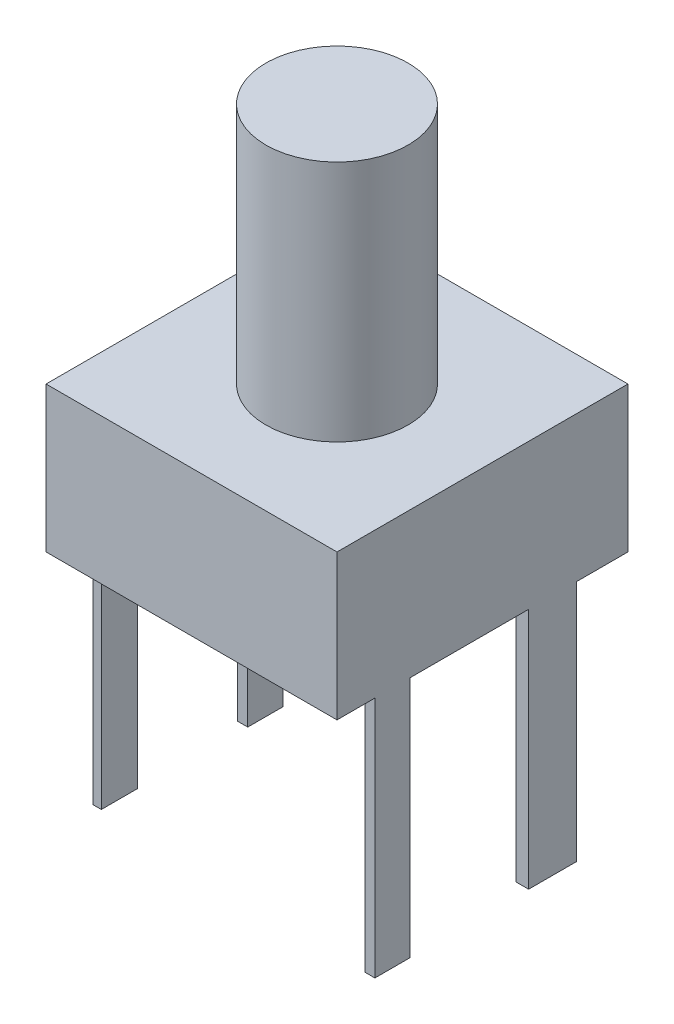
ISO-10303-21;
HEADER;
FILE_DESCRIPTION(('STEP AP214'),'2;1');
FILE_NAME('part.step','',(''),(''),'','','');
FILE_SCHEMA(('AUTOMOTIVE_DESIGN { 1 0 10303 214 1 1 1 1 }'));
ENDSEC;
DATA;
#1=APPLICATION_CONTEXT('core data for automotive mechanical design processes');
#2=APPLICATION_PROTOCOL_DEFINITION('international standard','automotive_design',2000,#1);
#3=PRODUCT_CONTEXT('',#1,'mechanical');
#4=PRODUCT('Part','Part','',(#3));
#5=PRODUCT_RELATED_PRODUCT_CATEGORY('part','',(#4));
#6=PRODUCT_DEFINITION_FORMATION('','',#4);
#7=PRODUCT_DEFINITION_CONTEXT('part definition',#1,'design');
#8=PRODUCT_DEFINITION('design','',#6,#7);
#9=PRODUCT_DEFINITION_SHAPE('','',#8);
#10=(LENGTH_UNIT() NAMED_UNIT(*) SI_UNIT(.MILLI.,.METRE.));
#11=(NAMED_UNIT(*) PLANE_ANGLE_UNIT() SI_UNIT($,.RADIAN.));
#12=(NAMED_UNIT(*) SI_UNIT($,.STERADIAN.) SOLID_ANGLE_UNIT());
#13=UNCERTAINTY_MEASURE_WITH_UNIT(LENGTH_MEASURE(1.E-05),#10,'distance_accuracy_value','');
#14=(GEOMETRIC_REPRESENTATION_CONTEXT(3) GLOBAL_UNCERTAINTY_ASSIGNED_CONTEXT((#13)) GLOBAL_UNIT_ASSIGNED_CONTEXT((#10,
#11,#12)) REPRESENTATION_CONTEXT('',''));
#15=CARTESIAN_POINT('',(0.,0.,0.));
#16=DIRECTION('',(0.,0.,1.));
#17=DIRECTION('',(1.,0.,0.));
#18=AXIS2_PLACEMENT_3D('',#15,#16,#17);
#19=CARTESIAN_POINT('',(0.,0.,0.));
#20=DIRECTION('',(0.,1.,0.));
#21=DIRECTION('',(0.,0.,1.));
#22=AXIS2_PLACEMENT_3D('',#19,#20,#21);
#23=PLANE('',#22);
#24=DIRECTION('',(-1.,0.,0.));
#25=VECTOR('',#24,1.);
#26=CARTESIAN_POINT('',(6.,0.,2.04853655429319));
#27=LINE('',#26,#25);
#28=CARTESIAN_POINT('',(6.,0.,2.04853655429319));
#29=VERTEX_POINT('',#28);
#30=CARTESIAN_POINT('',(5.73848969075964,0.,2.04853655429319));
#31=VERTEX_POINT('',#30);
#32=EDGE_CURVE('E338',#29,#31,#27,.T.);
#33=ORIENTED_EDGE('',*,*,#32,.F.);
#34=DIRECTION('',(0.,0.,-1.));
#35=VECTOR('',#34,1.);
#36=CARTESIAN_POINT('',(6.,0.,0.));
#37=LINE('',#36,#35);
#38=CARTESIAN_POINT('',(6.,0.,4.49592694721617));
#39=VERTEX_POINT('',#38);
#40=EDGE_CURVE('E193',#39,#29,#37,.T.);
#41=ORIENTED_EDGE('',*,*,#40,.F.);
#42=DIRECTION('',(1.,0.,0.));
#43=VECTOR('',#42,1.);
#44=CARTESIAN_POINT('',(6.,0.,4.49592694721617));
#45=LINE('',#44,#43);
#46=CARTESIAN_POINT('',(5.7923969681368,0.,4.49592694721617));
#47=VERTEX_POINT('',#46);
#48=EDGE_CURVE('E206',#47,#39,#45,.T.);
#49=ORIENTED_EDGE('',*,*,#48,.F.);
#50=DIRECTION('',(0.,0.,-1.));
#51=VECTOR('',#50,1.);
#52=CARTESIAN_POINT('',(5.7923969681368,0.,5.21828446407009));
#53=LINE('',#52,#51);
#54=CARTESIAN_POINT('',(5.7923969681368,0.,5.21828446407009));
#55=VERTEX_POINT('',#54);
#56=EDGE_CURVE('E196',#55,#47,#53,.T.);
#57=ORIENTED_EDGE('',*,*,#56,.F.);
#58=DIRECTION('',(-1.,0.,0.));
#59=VECTOR('',#58,1.);
#60=CARTESIAN_POINT('',(6.,0.,5.21828446407009));
#61=LINE('',#60,#59);
#62=CARTESIAN_POINT('',(6.,0.,5.21828446407009));
#63=VERTEX_POINT('',#62);
#64=EDGE_CURVE('E194',#63,#55,#61,.T.);
#65=ORIENTED_EDGE('',*,*,#64,.F.);
#66=CARTESIAN_POINT('',(6.,0.,6.));
#67=VERTEX_POINT('',#66);
#68=EDGE_CURVE('E301',#67,#63,#37,.T.);
#69=ORIENTED_EDGE('',*,*,#68,.F.);
#70=DIRECTION('',(1.,0.,0.));
#71=VECTOR('',#70,1.);
#72=CARTESIAN_POINT('',(0.,0.,6.));
#73=LINE('',#72,#71);
#74=CARTESIAN_POINT('',(0.,0.,6.));
#75=VERTEX_POINT('',#74);
#76=EDGE_CURVE('E297',#75,#67,#73,.T.);
#77=ORIENTED_EDGE('',*,*,#76,.F.);
#78=DIRECTION('',(0.,0.,1.));
#79=VECTOR('',#78,1.);
#80=CARTESIAN_POINT('',(0.,0.,0.));
#81=LINE('',#80,#79);
#82=CARTESIAN_POINT('',(0.,0.,5.02960899325004));
#83=VERTEX_POINT('',#82);
#84=EDGE_CURVE('E281',#83,#75,#81,.T.);
#85=ORIENTED_EDGE('',*,*,#84,.F.);
#86=DIRECTION('',(-1.,0.,0.));
#87=VECTOR('',#86,1.);
#88=CARTESIAN_POINT('',(0.,0.,5.02960899325004));
#89=LINE('',#88,#87);
#90=CARTESIAN_POINT('',(0.169867937699192,0.,5.02960899325004));
#91=VERTEX_POINT('',#90);
#92=EDGE_CURVE('E254',#91,#83,#89,.T.);
#93=ORIENTED_EDGE('',*,*,#92,.F.);
#94=DIRECTION('',(0.,0.,1.));
#95=VECTOR('',#94,1.);
#96=CARTESIAN_POINT('',(0.169867937699192,0.,5.02960899325004));
#97=LINE('',#96,#95);
#98=CARTESIAN_POINT('',(0.169867937699192,0.,4.28568856544525));
#99=VERTEX_POINT('',#98);
#100=EDGE_CURVE('E263',#99,#91,#97,.T.);
#101=ORIENTED_EDGE('',*,*,#100,.F.);
#102=DIRECTION('',(1.,0.,0.));
#103=VECTOR('',#102,1.);
#104=CARTESIAN_POINT('',(0.,0.,4.28568856544525));
#105=LINE('',#104,#103);
#106=CARTESIAN_POINT('',(0.,0.,4.28568856544525));
#107=VERTEX_POINT('',#106);
#108=EDGE_CURVE('E249',#107,#99,#105,.T.);
#109=ORIENTED_EDGE('',*,*,#108,.F.);
#110=CARTESIAN_POINT('',(0.,0.,2.04853655429319));
#111=VERTEX_POINT('',#110);
#112=EDGE_CURVE('E298',#111,#107,#81,.T.);
#113=ORIENTED_EDGE('',*,*,#112,.F.);
#114=DIRECTION('',(-1.,0.,0.));
#115=VECTOR('',#114,1.);
#116=CARTESIAN_POINT('',(0.,0.,2.04853655429319));
#117=LINE('',#116,#115);
#118=CARTESIAN_POINT('',(0.207603031863203,0.,2.04853655429319));
#119=VERTEX_POINT('',#118);
#120=EDGE_CURVE('E228',#119,#111,#117,.T.);
#121=ORIENTED_EDGE('',*,*,#120,.F.);
#122=DIRECTION('',(0.,0.,1.));
#123=VECTOR('',#122,1.);
#124=CARTESIAN_POINT('',(0.207603031863203,0.,2.04853655429319));
#125=LINE('',#124,#123);
#126=CARTESIAN_POINT('',(0.207603031863203,0.,1.32617903743926));
#127=VERTEX_POINT('',#126);
#128=EDGE_CURVE('E236',#127,#119,#125,.T.);
#129=ORIENTED_EDGE('',*,*,#128,.F.);
#130=DIRECTION('',(1.,0.,0.));
#131=VECTOR('',#130,1.);
#132=CARTESIAN_POINT('',(0.,0.,1.32617903743926));
#133=LINE('',#132,#131);
#134=CARTESIAN_POINT('',(0.,0.,1.32617903743926));
#135=VERTEX_POINT('',#134);
#136=EDGE_CURVE('E223',#135,#127,#133,.T.);
#137=ORIENTED_EDGE('',*,*,#136,.F.);
#138=CARTESIAN_POINT('',(0.,0.,0.));
#139=VERTEX_POINT('',#138);
#140=EDGE_CURVE('E294',#139,#135,#81,.T.);
#141=ORIENTED_EDGE('',*,*,#140,.F.);
#142=DIRECTION('',(-1.,0.,0.));
#143=VECTOR('',#142,1.);
#144=CARTESIAN_POINT('',(0.,0.,0.));
#145=LINE('',#144,#143);
#146=CARTESIAN_POINT('',(6.,0.,0.));
#147=VERTEX_POINT('',#146);
#148=EDGE_CURVE('E287',#147,#139,#145,.T.);
#149=ORIENTED_EDGE('',*,*,#148,.F.);
#150=CARTESIAN_POINT('',(6.,0.,1.06203337829119));
#151=VERTEX_POINT('',#150);
#152=EDGE_CURVE('E300',#151,#147,#37,.T.);
#153=ORIENTED_EDGE('',*,*,#152,.F.);
#154=DIRECTION('',(1.,0.,0.));
#155=VECTOR('',#154,1.);
#156=CARTESIAN_POINT('',(6.,0.,1.06203337829119));
#157=LINE('',#156,#155);
#158=CARTESIAN_POINT('',(5.73848969075964,0.,1.06203337829119));
#159=VERTEX_POINT('',#158);
#160=EDGE_CURVE('E188',#159,#151,#157,.T.);
#161=ORIENTED_EDGE('',*,*,#160,.F.);
#162=DIRECTION('',(0.,0.,-1.));
#163=VECTOR('',#162,1.);
#164=CARTESIAN_POINT('',(5.73848969075964,0.,2.04853655429319));
#165=LINE('',#164,#163);
#166=EDGE_CURVE('E565',#31,#159,#165,.T.);
#167=ORIENTED_EDGE('',*,*,#166,.F.);
#168=EDGE_LOOP('',(#33,#41,#49,#57,#65,#69,#77,#85,#93,#101,#109,#113,#121,#129,#137,#141,#149,
#153,#161,#167));
#169=FACE_BOUND('',#168,.T.);
#170=ADVANCED_FACE('F33',(#169),#23,.F.);
#171=CARTESIAN_POINT('',(0.,3.,0.));
#172=DIRECTION('',(1.,0.,0.));
#173=DIRECTION('',(0.,0.,-1.));
#174=AXIS2_PLACEMENT_3D('',#171,#172,#173);
#175=PLANE('',#174);
#176=ORIENTED_EDGE('',*,*,#140,.T.);
#177=DIRECTION('',(0.,1.,0.));
#178=VECTOR('',#177,1.);
#179=CARTESIAN_POINT('',(0.,-5.,1.32617903743926));
#180=LINE('',#179,#178);
#181=CARTESIAN_POINT('',(0.,-5.,1.32617903743926));
#182=VERTEX_POINT('',#181);
#183=EDGE_CURVE('E247',#182,#135,#180,.T.);
#184=ORIENTED_EDGE('',*,*,#183,.F.);
#185=DIRECTION('',(0.,0.,-1.));
#186=VECTOR('',#185,1.);
#187=CARTESIAN_POINT('',(0.,-5.,2.04853655429319));
#188=LINE('',#187,#186);
#189=CARTESIAN_POINT('',(0.,-5.,2.04853655429319));
#190=VERTEX_POINT('',#189);
#191=EDGE_CURVE('E224',#190,#182,#188,.T.);
#192=ORIENTED_EDGE('',*,*,#191,.F.);
#193=DIRECTION('',(0.,1.,0.));
#194=VECTOR('',#193,1.);
#195=CARTESIAN_POINT('',(0.,-5.,2.04853655429319));
#196=LINE('',#195,#194);
#197=EDGE_CURVE('E234',#190,#111,#196,.T.);
#198=ORIENTED_EDGE('',*,*,#197,.T.);
#199=ORIENTED_EDGE('',*,*,#112,.T.);
#200=DIRECTION('',(0.,1.,0.));
#201=VECTOR('',#200,1.);
#202=CARTESIAN_POINT('',(0.,-5.,4.28568856544525));
#203=LINE('',#202,#201);
#204=CARTESIAN_POINT('',(0.,-5.,4.28568856544525));
#205=VERTEX_POINT('',#204);
#206=EDGE_CURVE('E276',#205,#107,#203,.T.);
#207=ORIENTED_EDGE('',*,*,#206,.F.);
#208=DIRECTION('',(0.,0.,-1.));
#209=VECTOR('',#208,1.);
#210=CARTESIAN_POINT('',(0.,-5.,5.02960899325004));
#211=LINE('',#210,#209);
#212=CARTESIAN_POINT('',(0.,-5.,5.02960899325004));
#213=VERTEX_POINT('',#212);
#214=EDGE_CURVE('E250',#213,#205,#211,.T.);
#215=ORIENTED_EDGE('',*,*,#214,.F.);
#216=DIRECTION('',(0.,1.,0.));
#217=VECTOR('',#216,1.);
#218=CARTESIAN_POINT('',(0.,-5.,5.02960899325004));
#219=LINE('',#218,#217);
#220=EDGE_CURVE('E260',#213,#83,#219,.T.);
#221=ORIENTED_EDGE('',*,*,#220,.T.);
#222=ORIENTED_EDGE('',*,*,#84,.T.);
#223=DIRECTION('',(0.,-1.,0.));
#224=VECTOR('',#223,1.);
#225=CARTESIAN_POINT('',(0.,3.,6.));
#226=LINE('',#225,#224);
#227=CARTESIAN_POINT('',(0.,3.,6.));
#228=VERTEX_POINT('',#227);
#229=EDGE_CURVE('E37',#228,#75,#226,.T.);
#230=ORIENTED_EDGE('',*,*,#229,.F.);
#231=DIRECTION('',(0.,0.,1.));
#232=VECTOR('',#231,1.);
#233=CARTESIAN_POINT('',(0.,3.,0.));
#234=LINE('',#233,#232);
#235=CARTESIAN_POINT('',(0.,3.,0.));
#236=VERTEX_POINT('',#235);
#237=EDGE_CURVE('E283',#236,#228,#234,.T.);
#238=ORIENTED_EDGE('',*,*,#237,.F.);
#239=DIRECTION('',(0.,-1.,0.));
#240=VECTOR('',#239,1.);
#241=CARTESIAN_POINT('',(0.,3.,0.));
#242=LINE('',#241,#240);
#243=EDGE_CURVE('E293',#236,#139,#242,.T.);
#244=ORIENTED_EDGE('',*,*,#243,.T.);
#245=EDGE_LOOP('',(#176,#184,#192,#198,#199,#207,#215,#221,#222,#230,#238,#244));
#246=FACE_BOUND('',#245,.T.);
#247=ADVANCED_FACE('F35',(#246),#175,.F.);
#248=CARTESIAN_POINT('',(0.,3.,6.));
#249=DIRECTION('',(0.,0.,-1.));
#250=DIRECTION('',(-1.,0.,0.));
#251=AXIS2_PLACEMENT_3D('',#248,#249,#250);
#252=PLANE('',#251);
#253=ORIENTED_EDGE('',*,*,#76,.T.);
#254=DIRECTION('',(0.,-1.,0.));
#255=VECTOR('',#254,1.);
#256=CARTESIAN_POINT('',(6.,3.,6.));
#257=LINE('',#256,#255);
#258=CARTESIAN_POINT('',(6.,3.,6.));
#259=VERTEX_POINT('',#258);
#260=EDGE_CURVE('E308',#259,#67,#257,.T.);
#261=ORIENTED_EDGE('',*,*,#260,.F.);
#262=DIRECTION('',(1.,0.,0.));
#263=VECTOR('',#262,1.);
#264=CARTESIAN_POINT('',(0.,3.,6.));
#265=LINE('',#264,#263);
#266=EDGE_CURVE('E286',#228,#259,#265,.T.);
#267=ORIENTED_EDGE('',*,*,#266,.F.);
#268=ORIENTED_EDGE('',*,*,#229,.T.);
#269=EDGE_LOOP('',(#253,#261,#267,#268));
#270=FACE_BOUND('',#269,.T.);
#271=ADVANCED_FACE('F316',(#270),#252,.F.);
#272=CARTESIAN_POINT('',(6.,3.,0.));
#273=DIRECTION('',(-1.,0.,0.));
#274=DIRECTION('',(0.,0.,1.));
#275=AXIS2_PLACEMENT_3D('',#272,#273,#274);
#276=PLANE('',#275);
#277=ORIENTED_EDGE('',*,*,#68,.T.);
#278=DIRECTION('',(0.,1.,0.));
#279=VECTOR('',#278,1.);
#280=CARTESIAN_POINT('',(6.,-5.,5.21828446407009));
#281=LINE('',#280,#279);
#282=CARTESIAN_POINT('',(6.,-5.,5.21828446407009));
#283=VERTEX_POINT('',#282);
#284=EDGE_CURVE('E221',#283,#63,#281,.T.);
#285=ORIENTED_EDGE('',*,*,#284,.F.);
#286=DIRECTION('',(0.,0.,1.));
#287=VECTOR('',#286,1.);
#288=CARTESIAN_POINT('',(6.,-5.,5.21828446407009));
#289=LINE('',#288,#287);
#290=CARTESIAN_POINT('',(6.,-5.,4.49592694721617));
#291=VERTEX_POINT('',#290);
#292=EDGE_CURVE('E202',#291,#283,#289,.T.);
#293=ORIENTED_EDGE('',*,*,#292,.F.);
#294=DIRECTION('',(0.,1.,0.));
#295=VECTOR('',#294,1.);
#296=CARTESIAN_POINT('',(6.,-5.,4.49592694721617));
#297=LINE('',#296,#295);
#298=EDGE_CURVE('E56',#291,#39,#297,.T.);
#299=ORIENTED_EDGE('',*,*,#298,.T.);
#300=ORIENTED_EDGE('',*,*,#40,.T.);
#301=DIRECTION('',(0.,1.,0.));
#302=VECTOR('',#301,1.);
#303=CARTESIAN_POINT('',(6.,-5.,2.04853655429319));
#304=LINE('',#303,#302);
#305=CARTESIAN_POINT('',(6.,-5.,2.04853655429319));
#306=VERTEX_POINT('',#305);
#307=EDGE_CURVE('E176',#306,#29,#304,.T.);
#308=ORIENTED_EDGE('',*,*,#307,.F.);
#309=DIRECTION('',(0.,0.,1.));
#310=VECTOR('',#309,1.);
#311=CARTESIAN_POINT('',(6.,-5.,2.04853655429319));
#312=LINE('',#311,#310);
#313=CARTESIAN_POINT('',(6.,-5.,1.06203337829119));
#314=VERTEX_POINT('',#313);
#315=EDGE_CURVE('E183',#314,#306,#312,.T.);
#316=ORIENTED_EDGE('',*,*,#315,.F.);
#317=DIRECTION('',(0.,1.,0.));
#318=VECTOR('',#317,1.);
#319=CARTESIAN_POINT('',(6.,-5.,1.06203337829119));
#320=LINE('',#319,#318);
#321=EDGE_CURVE('E49',#314,#151,#320,.T.);
#322=ORIENTED_EDGE('',*,*,#321,.T.);
#323=ORIENTED_EDGE('',*,*,#152,.T.);
#324=DIRECTION('',(0.,-1.,0.));
#325=VECTOR('',#324,1.);
#326=CARTESIAN_POINT('',(6.,3.,0.));
#327=LINE('',#326,#325);
#328=CARTESIAN_POINT('',(6.,3.,0.));
#329=VERTEX_POINT('',#328);
#330=EDGE_CURVE('E306',#329,#147,#327,.T.);
#331=ORIENTED_EDGE('',*,*,#330,.F.);
#332=DIRECTION('',(0.,0.,-1.));
#333=VECTOR('',#332,1.);
#334=CARTESIAN_POINT('',(6.,3.,0.));
#335=LINE('',#334,#333);
#336=EDGE_CURVE('E289',#259,#329,#335,.T.);
#337=ORIENTED_EDGE('',*,*,#336,.F.);
#338=ORIENTED_EDGE('',*,*,#260,.T.);
#339=EDGE_LOOP('',(#277,#285,#293,#299,#300,#308,#316,#322,#323,#331,#337,#338));
#340=FACE_BOUND('',#339,.T.);
#341=ADVANCED_FACE('F191',(#340),#276,.F.);
#342=CARTESIAN_POINT('',(0.,3.,0.));
#343=DIRECTION('',(0.,0.,1.));
#344=DIRECTION('',(1.,0.,0.));
#345=AXIS2_PLACEMENT_3D('',#342,#343,#344);
#346=PLANE('',#345);
#347=ORIENTED_EDGE('',*,*,#148,.T.);
#348=ORIENTED_EDGE('',*,*,#243,.F.);
#349=DIRECTION('',(-1.,0.,0.));
#350=VECTOR('',#349,1.);
#351=CARTESIAN_POINT('',(0.,3.,0.));
#352=LINE('',#351,#350);
#353=EDGE_CURVE('E291',#329,#236,#352,.T.);
#354=ORIENTED_EDGE('',*,*,#353,.F.);
#355=ORIENTED_EDGE('',*,*,#330,.T.);
#356=EDGE_LOOP('',(#347,#348,#354,#355));
#357=FACE_BOUND('',#356,.T.);
#358=ADVANCED_FACE('F345',(#357),#346,.F.);
#359=CARTESIAN_POINT('',(0.,3.,0.));
#360=DIRECTION('',(0.,1.,0.));
#361=DIRECTION('',(0.,0.,1.));
#362=AXIS2_PLACEMENT_3D('',#359,#360,#361);
#363=PLANE('',#362);
#364=CARTESIAN_POINT('',(3.,3.,3.));
#365=DIRECTION('',(0.,1.,0.));
#366=DIRECTION('',(0.,0.,1.));
#367=AXIS2_PLACEMENT_3D('',#364,#365,#366);
#368=CIRCLE('',#367,1.46607230965002);
#369=CARTESIAN_POINT('',(3.,3.,4.46607230965002));
#370=VERTEX_POINT('',#369);
#371=EDGE_CURVE('E11',#370,#370,#368,.T.);
#372=ORIENTED_EDGE('',*,*,#371,.F.);
#373=EDGE_LOOP('',(#372));
#374=FACE_BOUND('',#373,.T.);
#375=ORIENTED_EDGE('',*,*,#237,.T.);
#376=ORIENTED_EDGE('',*,*,#266,.T.);
#377=ORIENTED_EDGE('',*,*,#336,.T.);
#378=ORIENTED_EDGE('',*,*,#353,.T.);
#379=EDGE_LOOP('',(#375,#376,#377,#378));
#380=FACE_BOUND('',#379,.T.);
#381=ADVANCED_FACE('F395',(#374,#380),#363,.T.);
#382=CARTESIAN_POINT('',(3.,8.,3.));
#383=DIRECTION('',(0.,-1.,0.));
#384=DIRECTION('',(0.,0.,-1.));
#385=AXIS2_PLACEMENT_3D('',#382,#383,#384);
#386=CYLINDRICAL_SURFACE('',#385,1.46607230965002);
#387=CARTESIAN_POINT('',(3.,8.,3.));
#388=DIRECTION('',(0.,1.,0.));
#389=DIRECTION('',(0.,0.,1.));
#390=AXIS2_PLACEMENT_3D('',#387,#388,#389);
#391=CIRCLE('',#390,1.46607230965002);
#392=CARTESIAN_POINT('',(3.,8.,4.46607230965002));
#393=VERTEX_POINT('',#392);
#394=EDGE_CURVE('E279',#393,#393,#391,.T.);
#395=ORIENTED_EDGE('',*,*,#394,.F.);
#396=EDGE_LOOP('',(#395));
#397=FACE_BOUND('',#396,.T.);
#398=ORIENTED_EDGE('',*,*,#371,.T.);
#399=EDGE_LOOP('',(#398));
#400=FACE_BOUND('',#399,.T.);
#401=ADVANCED_FACE('F420',(#397,#400),#386,.T.);
#402=CARTESIAN_POINT('',(3.,8.,3.));
#403=DIRECTION('',(0.,1.,0.));
#404=DIRECTION('',(0.,0.,1.));
#405=AXIS2_PLACEMENT_3D('',#402,#403,#404);
#406=PLANE('',#405);
#407=ORIENTED_EDGE('',*,*,#394,.T.);
#408=EDGE_LOOP('',(#407));
#409=FACE_BOUND('',#408,.T.);
#410=ADVANCED_FACE('F386',(#409),#406,.T.);
#411=CARTESIAN_POINT('',(0.,-5.,4.28568856544525));
#412=DIRECTION('',(0.,0.,1.));
#413=DIRECTION('',(1.,0.,0.));
#414=AXIS2_PLACEMENT_3D('',#411,#412,#413);
#415=PLANE('',#414);
#416=ORIENTED_EDGE('',*,*,#108,.T.);
#417=DIRECTION('',(0.,1.,0.));
#418=VECTOR('',#417,1.);
#419=CARTESIAN_POINT('',(0.169867937699192,-5.,4.28568856544525));
#420=LINE('',#419,#418);
#421=CARTESIAN_POINT('',(0.169867937699192,-5.,4.28568856544525));
#422=VERTEX_POINT('',#421);
#423=EDGE_CURVE('E273',#422,#99,#420,.T.);
#424=ORIENTED_EDGE('',*,*,#423,.F.);
#425=DIRECTION('',(1.,0.,0.));
#426=VECTOR('',#425,1.);
#427=CARTESIAN_POINT('',(0.,-5.,4.28568856544525));
#428=LINE('',#427,#426);
#429=EDGE_CURVE('E253',#205,#422,#428,.T.);
#430=ORIENTED_EDGE('',*,*,#429,.F.);
#431=ORIENTED_EDGE('',*,*,#206,.T.);
#432=EDGE_LOOP('',(#416,#424,#430,#431));
#433=FACE_BOUND('',#432,.T.);
#434=ADVANCED_FACE('F369',(#433),#415,.F.);
#435=CARTESIAN_POINT('',(0.169867937699192,-5.,5.02960899325004));
#436=DIRECTION('',(-1.,0.,0.));
#437=DIRECTION('',(0.,0.,1.));
#438=AXIS2_PLACEMENT_3D('',#435,#436,#437);
#439=PLANE('',#438);
#440=ORIENTED_EDGE('',*,*,#100,.T.);
#441=DIRECTION('',(0.,1.,0.));
#442=VECTOR('',#441,1.);
#443=CARTESIAN_POINT('',(0.169867937699192,-5.,5.02960899325004));
#444=LINE('',#443,#442);
#445=CARTESIAN_POINT('',(0.169867937699192,-5.,5.02960899325004));
#446=VERTEX_POINT('',#445);
#447=EDGE_CURVE('E270',#446,#91,#444,.T.);
#448=ORIENTED_EDGE('',*,*,#447,.F.);
#449=DIRECTION('',(0.,0.,1.));
#450=VECTOR('',#449,1.);
#451=CARTESIAN_POINT('',(0.169867937699192,-5.,5.02960899325004));
#452=LINE('',#451,#450);
#453=EDGE_CURVE('E256',#422,#446,#452,.T.);
#454=ORIENTED_EDGE('',*,*,#453,.F.);
#455=ORIENTED_EDGE('',*,*,#423,.T.);
#456=EDGE_LOOP('',(#440,#448,#454,#455));
#457=FACE_BOUND('',#456,.T.);
#458=ADVANCED_FACE('F378',(#457),#439,.F.);
#459=CARTESIAN_POINT('',(0.,-5.,5.02960899325004));
#460=DIRECTION('',(0.,0.,-1.));
#461=DIRECTION('',(-1.,0.,0.));
#462=AXIS2_PLACEMENT_3D('',#459,#460,#461);
#463=PLANE('',#462);
#464=ORIENTED_EDGE('',*,*,#92,.T.);
#465=ORIENTED_EDGE('',*,*,#220,.F.);
#466=DIRECTION('',(-1.,0.,0.));
#467=VECTOR('',#466,1.);
#468=CARTESIAN_POINT('',(0.,-5.,5.02960899325004));
#469=LINE('',#468,#467);
#470=EDGE_CURVE('E258',#446,#213,#469,.T.);
#471=ORIENTED_EDGE('',*,*,#470,.F.);
#472=ORIENTED_EDGE('',*,*,#447,.T.);
#473=EDGE_LOOP('',(#464,#465,#471,#472));
#474=FACE_BOUND('',#473,.T.);
#475=ADVANCED_FACE('F376',(#474),#463,.F.);
#476=CARTESIAN_POINT('',(0.,-5.,0.));
#477=DIRECTION('',(0.,-1.,0.));
#478=DIRECTION('',(0.,0.,-1.));
#479=AXIS2_PLACEMENT_3D('',#476,#477,#478);
#480=PLANE('',#479);
#481=ORIENTED_EDGE('',*,*,#214,.T.);
#482=ORIENTED_EDGE('',*,*,#429,.T.);
#483=ORIENTED_EDGE('',*,*,#453,.T.);
#484=ORIENTED_EDGE('',*,*,#470,.T.);
#485=EDGE_LOOP('',(#481,#482,#483,#484));
#486=FACE_BOUND('',#485,.T.);
#487=ADVANCED_FACE('F372',(#486),#480,.T.);
#488=CARTESIAN_POINT('',(0.,-5.,1.32617903743926));
#489=DIRECTION('',(0.,0.,1.));
#490=DIRECTION('',(1.,0.,0.));
#491=AXIS2_PLACEMENT_3D('',#488,#489,#490);
#492=PLANE('',#491);
#493=ORIENTED_EDGE('',*,*,#136,.T.);
#494=DIRECTION('',(0.,1.,0.));
#495=VECTOR('',#494,1.);
#496=CARTESIAN_POINT('',(0.207603031863203,-5.,1.32617903743926));
#497=LINE('',#496,#495);
#498=CARTESIAN_POINT('',(0.207603031863203,-5.,1.32617903743926));
#499=VERTEX_POINT('',#498);
#500=EDGE_CURVE('E244',#499,#127,#497,.T.);
#501=ORIENTED_EDGE('',*,*,#500,.F.);
#502=DIRECTION('',(1.,0.,0.));
#503=VECTOR('',#502,1.);
#504=CARTESIAN_POINT('',(0.,-5.,1.32617903743926));
#505=LINE('',#504,#503);
#506=EDGE_CURVE('E227',#182,#499,#505,.T.);
#507=ORIENTED_EDGE('',*,*,#506,.F.);
#508=ORIENTED_EDGE('',*,*,#183,.T.);
#509=EDGE_LOOP('',(#493,#501,#507,#508));
#510=FACE_BOUND('',#509,.T.);
#511=ADVANCED_FACE('F353',(#510),#492,.F.);
#512=CARTESIAN_POINT('',(0.207603031863203,-5.,2.04853655429319));
#513=DIRECTION('',(-1.,0.,0.));
#514=DIRECTION('',(0.,0.,1.));
#515=AXIS2_PLACEMENT_3D('',#512,#513,#514);
#516=PLANE('',#515);
#517=ORIENTED_EDGE('',*,*,#128,.T.);
#518=DIRECTION('',(0.,1.,0.));
#519=VECTOR('',#518,1.);
#520=CARTESIAN_POINT('',(0.207603031863203,-5.,2.04853655429319));
#521=LINE('',#520,#519);
#522=CARTESIAN_POINT('',(0.207603031863203,-5.,2.04853655429319));
#523=VERTEX_POINT('',#522);
#524=EDGE_CURVE('E241',#523,#119,#521,.T.);
#525=ORIENTED_EDGE('',*,*,#524,.F.);
#526=DIRECTION('',(0.,0.,1.));
#527=VECTOR('',#526,1.);
#528=CARTESIAN_POINT('',(0.207603031863203,-5.,2.04853655429319));
#529=LINE('',#528,#527);
#530=EDGE_CURVE('E230',#499,#523,#529,.T.);
#531=ORIENTED_EDGE('',*,*,#530,.F.);
#532=ORIENTED_EDGE('',*,*,#500,.T.);
#533=EDGE_LOOP('',(#517,#525,#531,#532));
#534=FACE_BOUND('',#533,.T.);
#535=ADVANCED_FACE('F464',(#534),#516,.F.);
#536=CARTESIAN_POINT('',(0.,-5.,2.04853655429319));
#537=DIRECTION('',(0.,0.,-1.));
#538=DIRECTION('',(-1.,0.,0.));
#539=AXIS2_PLACEMENT_3D('',#536,#537,#538);
#540=PLANE('',#539);
#541=ORIENTED_EDGE('',*,*,#120,.T.);
#542=ORIENTED_EDGE('',*,*,#197,.F.);
#543=DIRECTION('',(-1.,0.,0.));
#544=VECTOR('',#543,1.);
#545=CARTESIAN_POINT('',(0.,-5.,2.04853655429319));
#546=LINE('',#545,#544);
#547=EDGE_CURVE('E232',#523,#190,#546,.T.);
#548=ORIENTED_EDGE('',*,*,#547,.F.);
#549=ORIENTED_EDGE('',*,*,#524,.T.);
#550=EDGE_LOOP('',(#541,#542,#548,#549));
#551=FACE_BOUND('',#550,.T.);
#552=ADVANCED_FACE('F362',(#551),#540,.F.);
#553=CARTESIAN_POINT('',(0.,-5.,0.));
#554=DIRECTION('',(0.,-1.,0.));
#555=DIRECTION('',(0.,0.,-1.));
#556=AXIS2_PLACEMENT_3D('',#553,#554,#555);
#557=PLANE('',#556);
#558=ORIENTED_EDGE('',*,*,#191,.T.);
#559=ORIENTED_EDGE('',*,*,#506,.T.);
#560=ORIENTED_EDGE('',*,*,#530,.T.);
#561=ORIENTED_EDGE('',*,*,#547,.T.);
#562=EDGE_LOOP('',(#558,#559,#560,#561));
#563=FACE_BOUND('',#562,.T.);
#564=ADVANCED_FACE('F357',(#563),#557,.T.);
#565=CARTESIAN_POINT('',(6.,-5.,5.21828446407009));
#566=DIRECTION('',(0.,0.,-1.));
#567=DIRECTION('',(-1.,0.,0.));
#568=AXIS2_PLACEMENT_3D('',#565,#566,#567);
#569=PLANE('',#568);
#570=ORIENTED_EDGE('',*,*,#64,.T.);
#571=DIRECTION('',(0.,1.,0.));
#572=VECTOR('',#571,1.);
#573=CARTESIAN_POINT('',(5.7923969681368,-5.,5.21828446407009));
#574=LINE('',#573,#572);
#575=CARTESIAN_POINT('',(5.7923969681368,-5.,5.21828446407009));
#576=VERTEX_POINT('',#575);
#577=EDGE_CURVE('E218',#576,#55,#574,.T.);
#578=ORIENTED_EDGE('',*,*,#577,.F.);
#579=DIRECTION('',(-1.,0.,0.));
#580=VECTOR('',#579,1.);
#581=CARTESIAN_POINT('',(6.,-5.,5.21828446407009));
#582=LINE('',#581,#580);
#583=EDGE_CURVE('E205',#283,#576,#582,.T.);
#584=ORIENTED_EDGE('',*,*,#583,.F.);
#585=ORIENTED_EDGE('',*,*,#284,.T.);
#586=EDGE_LOOP('',(#570,#578,#584,#585));
#587=FACE_BOUND('',#586,.T.);
#588=ADVANCED_FACE('F327',(#587),#569,.F.);
#589=CARTESIAN_POINT('',(5.7923969681368,-5.,5.21828446407009));
#590=DIRECTION('',(1.,0.,0.));
#591=DIRECTION('',(0.,0.,-1.));
#592=AXIS2_PLACEMENT_3D('',#589,#590,#591);
#593=PLANE('',#592);
#594=ORIENTED_EDGE('',*,*,#56,.T.);
#595=DIRECTION('',(0.,1.,0.));
#596=VECTOR('',#595,1.);
#597=CARTESIAN_POINT('',(5.7923969681368,-5.,4.49592694721617));
#598=LINE('',#597,#596);
#599=CARTESIAN_POINT('',(5.7923969681368,-5.,4.49592694721617));
#600=VERTEX_POINT('',#599);
#601=EDGE_CURVE('E215',#600,#47,#598,.T.);
#602=ORIENTED_EDGE('',*,*,#601,.F.);
#603=DIRECTION('',(0.,0.,-1.));
#604=VECTOR('',#603,1.);
#605=CARTESIAN_POINT('',(5.7923969681368,-5.,5.21828446407009));
#606=LINE('',#605,#604);
#607=EDGE_CURVE('E208',#576,#600,#606,.T.);
#608=ORIENTED_EDGE('',*,*,#607,.F.);
#609=ORIENTED_EDGE('',*,*,#577,.T.);
#610=EDGE_LOOP('',(#594,#602,#608,#609));
#611=FACE_BOUND('',#610,.T.);
#612=ADVANCED_FACE('F498',(#611),#593,.F.);
#613=CARTESIAN_POINT('',(6.,-5.,4.49592694721617));
#614=DIRECTION('',(0.,0.,1.));
#615=DIRECTION('',(1.,0.,0.));
#616=AXIS2_PLACEMENT_3D('',#613,#614,#615);
#617=PLANE('',#616);
#618=ORIENTED_EDGE('',*,*,#48,.T.);
#619=ORIENTED_EDGE('',*,*,#298,.F.);
#620=DIRECTION('',(1.,0.,0.));
#621=VECTOR('',#620,1.);
#622=CARTESIAN_POINT('',(6.,-5.,4.49592694721617));
#623=LINE('',#622,#621);
#624=EDGE_CURVE('E210',#600,#291,#623,.T.);
#625=ORIENTED_EDGE('',*,*,#624,.F.);
#626=ORIENTED_EDGE('',*,*,#601,.T.);
#627=EDGE_LOOP('',(#618,#619,#625,#626));
#628=FACE_BOUND('',#627,.T.);
#629=ADVANCED_FACE('F335',(#628),#617,.F.);
#630=CARTESIAN_POINT('',(0.,-5.,0.));
#631=DIRECTION('',(0.,1.,0.));
#632=DIRECTION('',(0.,0.,1.));
#633=AXIS2_PLACEMENT_3D('',#630,#631,#632);
#634=PLANE('',#633);
#635=ORIENTED_EDGE('',*,*,#292,.T.);
#636=ORIENTED_EDGE('',*,*,#583,.T.);
#637=ORIENTED_EDGE('',*,*,#607,.T.);
#638=ORIENTED_EDGE('',*,*,#624,.T.);
#639=EDGE_LOOP('',(#635,#636,#637,#638));
#640=FACE_BOUND('',#639,.T.);
#641=ADVANCED_FACE('F331',(#640),#634,.F.);
#642=CARTESIAN_POINT('',(6.,-5.,2.04853655429319));
#643=DIRECTION('',(0.,0.,-1.));
#644=DIRECTION('',(-1.,0.,0.));
#645=AXIS2_PLACEMENT_3D('',#642,#643,#644);
#646=PLANE('',#645);
#647=ORIENTED_EDGE('',*,*,#32,.T.);
#648=DIRECTION('',(0.,1.,0.));
#649=VECTOR('',#648,1.);
#650=CARTESIAN_POINT('',(5.73848969075964,-5.,2.04853655429319));
#651=LINE('',#650,#649);
#652=CARTESIAN_POINT('',(5.73848969075964,-5.,2.04853655429319));
#653=VERTEX_POINT('',#652);
#654=EDGE_CURVE('E179',#653,#31,#651,.T.);
#655=ORIENTED_EDGE('',*,*,#654,.F.);
#656=DIRECTION('',(-1.,0.,0.));
#657=VECTOR('',#656,1.);
#658=CARTESIAN_POINT('',(6.,-5.,2.04853655429319));
#659=LINE('',#658,#657);
#660=EDGE_CURVE('E172',#306,#653,#659,.T.);
#661=ORIENTED_EDGE('',*,*,#660,.F.);
#662=ORIENTED_EDGE('',*,*,#307,.T.);
#663=EDGE_LOOP('',(#647,#655,#661,#662));
#664=FACE_BOUND('',#663,.T.);
#665=ADVANCED_FACE('F174',(#664),#646,.F.);
#666=CARTESIAN_POINT('',(5.73848969075964,-5.,2.04853655429319));
#667=DIRECTION('',(1.,0.,0.));
#668=DIRECTION('',(0.,0.,-1.));
#669=AXIS2_PLACEMENT_3D('',#666,#667,#668);
#670=PLANE('',#669);
#671=ORIENTED_EDGE('',*,*,#166,.T.);
#672=DIRECTION('',(0.,1.,0.));
#673=VECTOR('',#672,1.);
#674=CARTESIAN_POINT('',(5.73848969075964,-5.,1.06203337829119));
#675=LINE('',#674,#673);
#676=CARTESIAN_POINT('',(5.73848969075964,-5.,1.06203337829119));
#677=VERTEX_POINT('',#676);
#678=EDGE_CURVE('E198',#677,#159,#675,.T.);
#679=ORIENTED_EDGE('',*,*,#678,.F.);
#680=DIRECTION('',(0.,0.,-1.));
#681=VECTOR('',#680,1.);
#682=CARTESIAN_POINT('',(5.73848969075964,-5.,2.04853655429319));
#683=LINE('',#682,#681);
#684=EDGE_CURVE('E182',#653,#677,#683,.T.);
#685=ORIENTED_EDGE('',*,*,#684,.F.);
#686=ORIENTED_EDGE('',*,*,#654,.T.);
#687=EDGE_LOOP('',(#671,#679,#685,#686));
#688=FACE_BOUND('',#687,.T.);
#689=ADVANCED_FACE('F532',(#688),#670,.F.);
#690=CARTESIAN_POINT('',(6.,-5.,1.06203337829119));
#691=DIRECTION('',(0.,0.,1.));
#692=DIRECTION('',(1.,0.,0.));
#693=AXIS2_PLACEMENT_3D('',#690,#691,#692);
#694=PLANE('',#693);
#695=ORIENTED_EDGE('',*,*,#160,.T.);
#696=ORIENTED_EDGE('',*,*,#321,.F.);
#697=DIRECTION('',(1.,0.,0.));
#698=VECTOR('',#697,1.);
#699=CARTESIAN_POINT('',(6.,-5.,1.06203337829119));
#700=LINE('',#699,#698);
#701=EDGE_CURVE('E187',#677,#314,#700,.T.);
#702=ORIENTED_EDGE('',*,*,#701,.F.);
#703=ORIENTED_EDGE('',*,*,#678,.T.);
#704=EDGE_LOOP('',(#695,#696,#702,#703));
#705=FACE_BOUND('',#704,.T.);
#706=ADVANCED_FACE('F541',(#705),#694,.F.);
#707=CARTESIAN_POINT('',(0.,-5.,0.));
#708=DIRECTION('',(0.,1.,0.));
#709=DIRECTION('',(0.,0.,1.));
#710=AXIS2_PLACEMENT_3D('',#707,#708,#709);
#711=PLANE('',#710);
#712=ORIENTED_EDGE('',*,*,#315,.T.);
#713=ORIENTED_EDGE('',*,*,#660,.T.);
#714=ORIENTED_EDGE('',*,*,#684,.T.);
#715=ORIENTED_EDGE('',*,*,#701,.T.);
#716=EDGE_LOOP('',(#712,#713,#714,#715));
#717=FACE_BOUND('',#716,.T.);
#718=ADVANCED_FACE('F185',(#717),#711,.F.);
#719=CLOSED_SHELL('',(#170,#247,#271,#341,#358,#381,#401,#410,#434,#458,#475,#487,#511,#535,
#552,#564,#588,#612,#629,#641,#665,#689,#706,#718));
#720=MANIFOLD_SOLID_BREP('B2',#719);
#721=ADVANCED_BREP_SHAPE_REPRESENTATION('',(#18,#720),#14);
#722=SHAPE_DEFINITION_REPRESENTATION(#9,#721);
ENDSEC;
END-ISO-10303-21;
